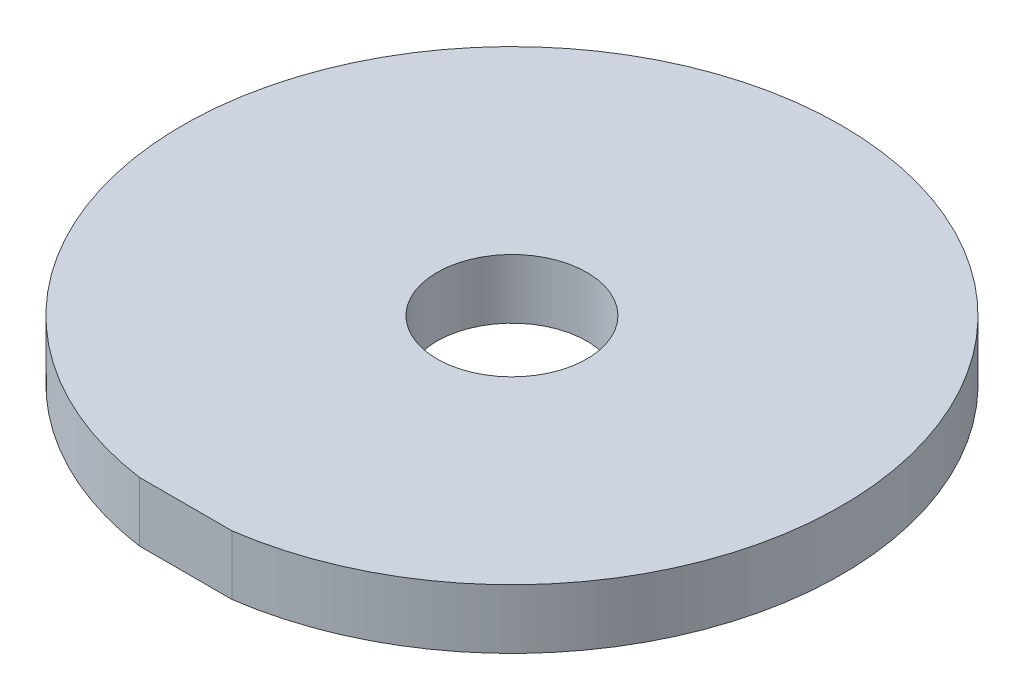
ISO-10303-21;
HEADER;
FILE_DESCRIPTION(('STEP AP214'),'2;1');
FILE_NAME('part.step','',(''),(''),'','','');
FILE_SCHEMA(('AUTOMOTIVE_DESIGN { 1 0 10303 214 1 1 1 1 }'));
ENDSEC;
DATA;
#1=APPLICATION_CONTEXT('core data for automotive mechanical design processes');
#2=APPLICATION_PROTOCOL_DEFINITION('international standard','automotive_design',2000,#1);
#3=PRODUCT_CONTEXT('',#1,'mechanical');
#4=PRODUCT('Part','Part','',(#3));
#5=PRODUCT_RELATED_PRODUCT_CATEGORY('part','',(#4));
#6=PRODUCT_DEFINITION_FORMATION('','',#4);
#7=PRODUCT_DEFINITION_CONTEXT('part definition',#1,'design');
#8=PRODUCT_DEFINITION('design','',#6,#7);
#9=PRODUCT_DEFINITION_SHAPE('','',#8);
#10=(LENGTH_UNIT() NAMED_UNIT(*) SI_UNIT(.MILLI.,.METRE.));
#11=(NAMED_UNIT(*) PLANE_ANGLE_UNIT() SI_UNIT($,.RADIAN.));
#12=(NAMED_UNIT(*) SI_UNIT($,.STERADIAN.) SOLID_ANGLE_UNIT());
#13=UNCERTAINTY_MEASURE_WITH_UNIT(LENGTH_MEASURE(1.E-05),#10,'distance_accuracy_value','');
#14=(GEOMETRIC_REPRESENTATION_CONTEXT(3) GLOBAL_UNCERTAINTY_ASSIGNED_CONTEXT((#13)) GLOBAL_UNIT_ASSIGNED_CONTEXT((#10,
#11,#12)) REPRESENTATION_CONTEXT('',''));
#15=CARTESIAN_POINT('',(0.,0.,0.));
#16=DIRECTION('',(0.,0.,1.));
#17=DIRECTION('',(1.,0.,0.));
#18=AXIS2_PLACEMENT_3D('',#15,#16,#17);
#19=CARTESIAN_POINT('',(38.3826465,0.,-17.5));
#20=DIRECTION('',(0.,1.,0.));
#21=DIRECTION('',(1.,0.,0.));
#22=AXIS2_PLACEMENT_3D('',#19,#20,#21);
#23=PLANE('',#22);
#24=CARTESIAN_POINT('',(25.,0.,-17.4125));
#25=DIRECTION('',(0.,-1.,0.));
#26=DIRECTION('',(1.,0.,0.));
#27=AXIS2_PLACEMENT_3D('',#24,#25,#26);
#28=CIRCLE('',#27,4.);
#29=CARTESIAN_POINT('',(21.,0.,-17.4125));
#30=VERTEX_POINT('',#29);
#31=EDGE_CURVE('E86',#30,#30,#28,.T.);
#32=ORIENTED_EDGE('',*,*,#31,.F.);
#33=EDGE_LOOP('',(#32));
#34=FACE_BOUND('',#33,.T.);
#35=CARTESIAN_POINT('',(25.,0.,-17.4125));
#36=DIRECTION('',(0.,1.,0.));
#37=DIRECTION('',(0.,0.,1.));
#38=AXIS2_PLACEMENT_3D('',#35,#36,#37);
#39=CIRCLE('',#38,17.5875);
#40=CARTESIAN_POINT('',(27.4748737341529,0.,0.));
#41=VERTEX_POINT('',#40);
#42=CARTESIAN_POINT('',(22.5251262658471,0.,0.));
#43=VERTEX_POINT('',#42);
#44=EDGE_CURVE('E79',#41,#43,#39,.T.);
#45=ORIENTED_EDGE('',*,*,#44,.F.);
#46=DIRECTION('',(1.,0.,0.));
#47=VECTOR('',#46,1.);
#48=CARTESIAN_POINT('',(0.,0.,0.));
#49=LINE('',#48,#47);
#50=EDGE_CURVE('E107',#43,#41,#49,.T.);
#51=ORIENTED_EDGE('',*,*,#50,.F.);
#52=EDGE_LOOP('',(#45,#51));
#53=FACE_BOUND('',#52,.T.);
#54=ADVANCED_FACE('F64',(#34,#53),#23,.F.);
#55=CARTESIAN_POINT('',(38.3826465,3.175,-17.5));
#56=DIRECTION('',(0.,1.,0.));
#57=DIRECTION('',(1.,0.,0.));
#58=AXIS2_PLACEMENT_3D('',#55,#56,#57);
#59=PLANE('',#58);
#60=CARTESIAN_POINT('',(25.,3.175,-17.4125));
#61=DIRECTION('',(0.,-1.,0.));
#62=DIRECTION('',(1.,0.,0.));
#63=AXIS2_PLACEMENT_3D('',#60,#61,#62);
#64=CIRCLE('',#63,4.);
#65=CARTESIAN_POINT('',(21.,3.175,-17.4125));
#66=VERTEX_POINT('',#65);
#67=EDGE_CURVE('E116',#66,#66,#64,.T.);
#68=ORIENTED_EDGE('',*,*,#67,.T.);
#69=EDGE_LOOP('',(#68));
#70=FACE_BOUND('',#69,.T.);
#71=DIRECTION('',(1.,0.,0.));
#72=VECTOR('',#71,1.);
#73=CARTESIAN_POINT('',(0.,3.175,0.));
#74=LINE('',#73,#72);
#75=CARTESIAN_POINT('',(22.5251262658471,3.175,0.));
#76=VERTEX_POINT('',#75);
#77=CARTESIAN_POINT('',(27.4748737341529,3.175,0.));
#78=VERTEX_POINT('',#77);
#79=EDGE_CURVE('E72',#76,#78,#74,.T.);
#80=ORIENTED_EDGE('',*,*,#79,.T.);
#81=CARTESIAN_POINT('',(25.,3.175,-17.4125));
#82=DIRECTION('',(0.,1.,0.));
#83=DIRECTION('',(0.,0.,1.));
#84=AXIS2_PLACEMENT_3D('',#81,#82,#83);
#85=CIRCLE('',#84,17.5875);
#86=EDGE_CURVE('E96',#78,#76,#85,.T.);
#87=ORIENTED_EDGE('',*,*,#86,.T.);
#88=EDGE_LOOP('',(#80,#87));
#89=FACE_BOUND('',#88,.T.);
#90=ADVANCED_FACE('F109',(#70,#89),#59,.T.);
#91=CARTESIAN_POINT('',(0.,0.,0.));
#92=DIRECTION('',(0.,0.,1.));
#93=DIRECTION('',(1.,0.,0.));
#94=AXIS2_PLACEMENT_3D('',#91,#92,#93);
#95=PLANE('',#94);
#96=ORIENTED_EDGE('',*,*,#50,.T.);
#97=DIRECTION('',(0.,1.,0.));
#98=VECTOR('',#97,1.);
#99=CARTESIAN_POINT('',(27.4748737341529,-6.825,0.));
#100=LINE('',#99,#98);
#101=EDGE_CURVE('E99',#41,#78,#100,.T.);
#102=ORIENTED_EDGE('',*,*,#101,.T.);
#103=ORIENTED_EDGE('',*,*,#79,.F.);
#104=DIRECTION('',(0.,1.,0.));
#105=VECTOR('',#104,1.);
#106=CARTESIAN_POINT('',(22.5251262658471,-6.825,0.));
#107=LINE('',#106,#105);
#108=EDGE_CURVE('E12',#76,#43,#107,.F.);
#109=ORIENTED_EDGE('',*,*,#108,.T.);
#110=EDGE_LOOP('',(#96,#102,#103,#109));
#111=FACE_BOUND('',#110,.T.);
#112=ADVANCED_FACE('F66',(#111),#95,.T.);
#113=CARTESIAN_POINT('',(25.,0.,-17.4125));
#114=DIRECTION('',(0.,1.,0.));
#115=DIRECTION('',(1.,0.,0.));
#116=AXIS2_PLACEMENT_3D('',#113,#114,#115);
#117=CYLINDRICAL_SURFACE('',#116,4.);
#118=ORIENTED_EDGE('',*,*,#67,.F.);
#119=DIRECTION('',(0.,-1.,0.));
#120=VECTOR('',#119,1.);
#121=CARTESIAN_POINT('',(21.,0.,-17.4125));
#122=LINE('',#121,#120);
#123=EDGE_CURVE('E113',#66,#30,#122,.T.);
#124=ORIENTED_EDGE('',*,*,#123,.T.);
#125=ORIENTED_EDGE('',*,*,#31,.T.);
#126=ORIENTED_EDGE('',*,*,#123,.F.);
#127=EDGE_LOOP('',(#118,#124,#125,#126));
#128=FACE_BOUND('',#127,.T.);
#129=ADVANCED_FACE('F120',(#128),#117,.F.);
#130=CARTESIAN_POINT('',(25.,-6.825,-17.4125));
#131=DIRECTION('',(0.,1.,0.));
#132=DIRECTION('',(0.,0.,1.));
#133=AXIS2_PLACEMENT_3D('',#130,#131,#132);
#134=CYLINDRICAL_SURFACE('',#133,17.5875);
#135=ORIENTED_EDGE('',*,*,#44,.T.);
#136=ORIENTED_EDGE('',*,*,#108,.F.);
#137=ORIENTED_EDGE('',*,*,#86,.F.);
#138=ORIENTED_EDGE('',*,*,#101,.F.);
#139=EDGE_LOOP('',(#135,#136,#137,#138));
#140=FACE_BOUND('',#139,.T.);
#141=ADVANCED_FACE('F98',(#140),#134,.T.);
#142=CLOSED_SHELL('',(#54,#90,#112,#129,#141));
#143=MANIFOLD_SOLID_BREP('B2',#142);
#144=ADVANCED_BREP_SHAPE_REPRESENTATION('',(#18,#143),#14);
#145=SHAPE_DEFINITION_REPRESENTATION(#9,#144);
ENDSEC;
END-ISO-10303-21;
